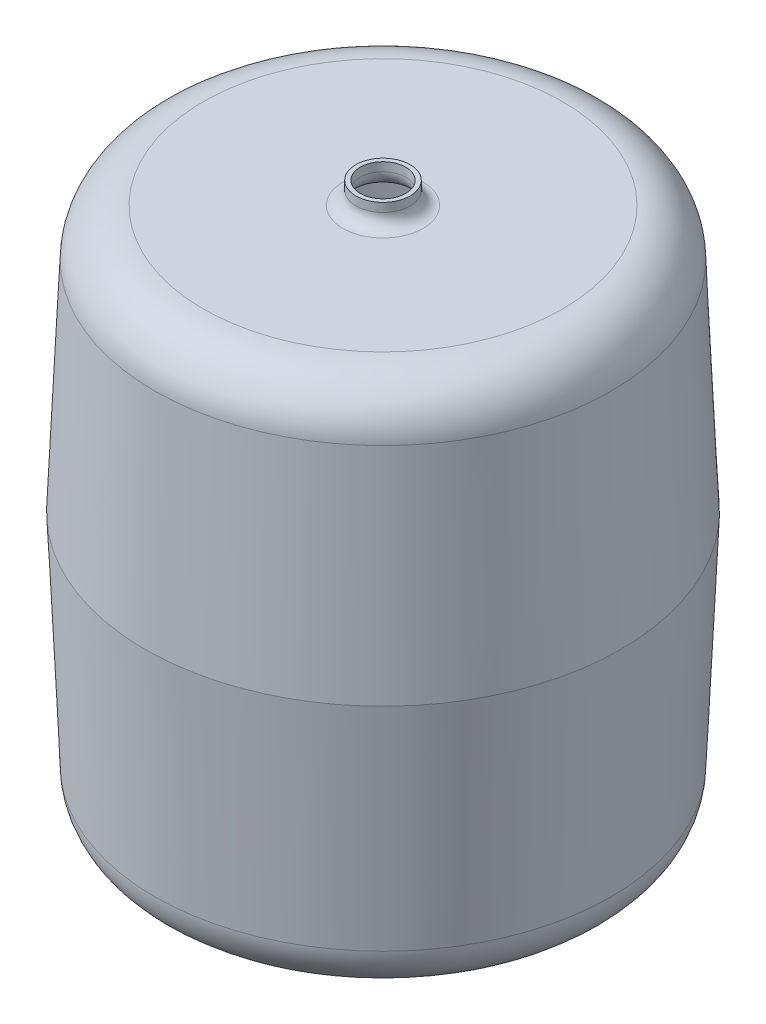
ISO-10303-21;
HEADER;
FILE_DESCRIPTION(('STEP AP214'),'2;1');
FILE_NAME('part.step','',(''),(''),'','','');
FILE_SCHEMA(('AUTOMOTIVE_DESIGN { 1 0 10303 214 1 1 1 1 }'));
ENDSEC;
DATA;
#1=APPLICATION_CONTEXT('core data for automotive mechanical design processes');
#2=APPLICATION_PROTOCOL_DEFINITION('international standard','automotive_design',2000,#1);
#3=PRODUCT_CONTEXT('',#1,'mechanical');
#4=PRODUCT('Part','Part','',(#3));
#5=PRODUCT_RELATED_PRODUCT_CATEGORY('part','',(#4));
#6=PRODUCT_DEFINITION_FORMATION('','',#4);
#7=PRODUCT_DEFINITION_CONTEXT('part definition',#1,'design');
#8=PRODUCT_DEFINITION('design','',#6,#7);
#9=PRODUCT_DEFINITION_SHAPE('','',#8);
#10=(LENGTH_UNIT() NAMED_UNIT(*) SI_UNIT(.MILLI.,.METRE.));
#11=(NAMED_UNIT(*) PLANE_ANGLE_UNIT() SI_UNIT($,.RADIAN.));
#12=(NAMED_UNIT(*) SI_UNIT($,.STERADIAN.) SOLID_ANGLE_UNIT());
#13=UNCERTAINTY_MEASURE_WITH_UNIT(LENGTH_MEASURE(1.E-05),#10,'distance_accuracy_value','');
#14=(GEOMETRIC_REPRESENTATION_CONTEXT(3) GLOBAL_UNCERTAINTY_ASSIGNED_CONTEXT((#13)) GLOBAL_UNIT_ASSIGNED_CONTEXT((#10,
#11,#12)) REPRESENTATION_CONTEXT('',''));
#15=CARTESIAN_POINT('',(0.,0.,0.));
#16=DIRECTION('',(0.,0.,1.));
#17=DIRECTION('',(1.,0.,0.));
#18=AXIS2_PLACEMENT_3D('',#15,#16,#17);
#19=CARTESIAN_POINT('',(0.,-2.89220124028748E-13,0.));
#20=DIRECTION('',(0.,-1.,0.));
#21=DIRECTION('',(1.,0.,0.));
#22=AXIS2_PLACEMENT_3D('',#19,#20,#21);
#23=PLANE('',#22);
#24=CARTESIAN_POINT('',(0.,-8.88178419700125E-13,0.));
#25=DIRECTION('',(0.,-1.,0.));
#26=DIRECTION('',(1.,0.,0.));
#27=AXIS2_PLACEMENT_3D('',#24,#25,#26);
#28=CIRCLE('',#27,165.671871598533);
#29=CARTESIAN_POINT('',(165.671871598533,-3.0973817164263E-13,0.));
#30=VERTEX_POINT('',#29);
#31=EDGE_CURVE('E10',#30,#30,#28,.T.);
#32=ORIENTED_EDGE('',*,*,#31,.T.);
#33=EDGE_LOOP('',(#32));
#34=FACE_BOUND('',#33,.T.);
#35=ADVANCED_FACE('F37',(#34),#23,.T.);
#36=CARTESIAN_POINT('',(-1.38777878078145E-13,44.9999999999991,0.));
#37=DIRECTION('',(0.,-1.,0.));
#38=DIRECTION('',(1.,0.,0.));
#39=AXIS2_PLACEMENT_3D('',#36,#37,#38);
#40=TOROIDAL_SURFACE('',#39,165.671871598534,45.);
#41=CARTESIAN_POINT('',(-1.50263327783035E-13,43.0371275685593,0.));
#42=DIRECTION('',(0.,-1.,0.));
#43=DIRECTION('',(1.,0.,0.));
#44=AXIS2_PLACEMENT_3D('',#41,#42,#43);
#45=CIRCLE('',#44,210.629041569717);
#46=CARTESIAN_POINT('',(210.629041569717,43.03712756856,0.));
#47=VERTEX_POINT('',#46);
#48=EDGE_CURVE('E43',#47,#47,#45,.T.);
#49=ORIENTED_EDGE('',*,*,#48,.T.);
#50=EDGE_LOOP('',(#49));
#51=FACE_BOUND('',#50,.T.);
#52=ORIENTED_EDGE('',*,*,#31,.F.);
#53=EDGE_LOOP('',(#52));
#54=FACE_BOUND('',#53,.T.);
#55=ADVANCED_FACE('F105',(#51,#54),#40,.T.);
#56=CARTESIAN_POINT('',(-1.50263327783035E-13,43.0371275685593,0.));
#57=DIRECTION('',(0.,1.,0.));
#58=DIRECTION('',(-1.,0.,0.));
#59=AXIS2_PLACEMENT_3D('',#56,#57,#58);
#60=CONICAL_SURFACE('',#59,210.629041569717,0.0436332312998579);
#61=CARTESIAN_POINT('',(-8.55412928016564E-13,244.999999999999,0.));
#62=DIRECTION('',(0.,-1.,0.));
#63=DIRECTION('',(1.,0.,0.));
#64=AXIS2_PLACEMENT_3D('',#61,#62,#63);
#65=CIRCLE('',#64,219.446931012585);
#66=CARTESIAN_POINT('',(219.446931012585,245.,0.));
#67=VERTEX_POINT('',#66);
#68=EDGE_CURVE('E47',#67,#67,#65,.T.);
#69=ORIENTED_EDGE('',*,*,#68,.T.);
#70=EDGE_LOOP('',(#69));
#71=FACE_BOUND('',#70,.T.);
#72=ORIENTED_EDGE('',*,*,#48,.F.);
#73=EDGE_LOOP('',(#72));
#74=FACE_BOUND('',#73,.T.);
#75=ADVANCED_FACE('F109',(#71,#74),#60,.T.);
#76=CARTESIAN_POINT('',(-8.55412928016564E-13,244.999999999999,0.));
#77=DIRECTION('',(0.,-1.,0.));
#78=DIRECTION('',(1.,0.,0.));
#79=AXIS2_PLACEMENT_3D('',#76,#77,#78);
#80=CONICAL_SURFACE('',#79,219.446931012585,0.0436332312998513);
#81=CARTESIAN_POINT('',(-1.56056252825009E-12,446.962872431439,0.));
#82=DIRECTION('',(0.,-1.,0.));
#83=DIRECTION('',(1.,0.,0.));
#84=AXIS2_PLACEMENT_3D('',#81,#82,#83);
#85=CIRCLE('',#84,210.629041569719);
#86=CARTESIAN_POINT('',(210.629041569717,446.96287243144,0.));
#87=VERTEX_POINT('',#86);
#88=EDGE_CURVE('E51',#87,#87,#85,.T.);
#89=ORIENTED_EDGE('',*,*,#88,.T.);
#90=EDGE_LOOP('',(#89));
#91=FACE_BOUND('',#90,.T.);
#92=ORIENTED_EDGE('',*,*,#68,.F.);
#93=EDGE_LOOP('',(#92));
#94=FACE_BOUND('',#93,.T.);
#95=ADVANCED_FACE('F113',(#91,#94),#80,.T.);
#96=CARTESIAN_POINT('',(-1.55431223447522E-12,444.999999999999,0.));
#97=DIRECTION('',(0.,-1.,0.));
#98=DIRECTION('',(1.,0.,0.));
#99=AXIS2_PLACEMENT_3D('',#96,#97,#98);
#100=TOROIDAL_SURFACE('',#99,165.671871598535,45.);
#101=CARTESIAN_POINT('',(-1.71082585603313E-12,489.999999999999,0.));
#102=DIRECTION('',(0.,-1.,0.));
#103=DIRECTION('',(1.,0.,0.));
#104=AXIS2_PLACEMENT_3D('',#101,#102,#103);
#105=CIRCLE('',#104,165.671871598535);
#106=CARTESIAN_POINT('',(165.671871598533,490.,0.));
#107=VERTEX_POINT('',#106);
#108=EDGE_CURVE('E56',#107,#107,#105,.T.);
#109=ORIENTED_EDGE('',*,*,#108,.T.);
#110=EDGE_LOOP('',(#109));
#111=FACE_BOUND('',#110,.T.);
#112=ORIENTED_EDGE('',*,*,#88,.F.);
#113=EDGE_LOOP('',(#112));
#114=FACE_BOUND('',#113,.T.);
#115=ADVANCED_FACE('F120',(#111,#114),#100,.T.);
#116=CARTESIAN_POINT('',(165.671871598533,490.,0.));
#117=DIRECTION('',(0.,1.,0.));
#118=DIRECTION('',(-1.,0.,0.));
#119=AXIS2_PLACEMENT_3D('',#116,#117,#118);
#120=PLANE('',#119);
#121=CARTESIAN_POINT('',(-1.71082585603314E-12,490.,0.));
#122=DIRECTION('',(0.,-1.,0.));
#123=DIRECTION('',(1.,0.,0.));
#124=AXIS2_PLACEMENT_3D('',#121,#122,#123);
#125=CIRCLE('',#124,37.0000000000017);
#126=CARTESIAN_POINT('',(37.,490.,0.));
#127=VERTEX_POINT('',#126);
#128=EDGE_CURVE('E59',#127,#127,#125,.T.);
#129=ORIENTED_EDGE('',*,*,#128,.T.);
#130=EDGE_LOOP('',(#129));
#131=FACE_BOUND('',#130,.T.);
#132=ORIENTED_EDGE('',*,*,#108,.F.);
#133=EDGE_LOOP('',(#132));
#134=FACE_BOUND('',#133,.T.);
#135=ADVANCED_FACE('F124',(#131,#134),#120,.T.);
#136=CARTESIAN_POINT('',(-1.74860126378462E-12,502.,0.));
#137=DIRECTION('',(0.,-1.,0.));
#138=DIRECTION('',(1.,0.,0.));
#139=AXIS2_PLACEMENT_3D('',#136,#137,#138);
#140=TOROIDAL_SURFACE('',#139,37.0000000000018,12.);
#141=CARTESIAN_POINT('',(-1.75272363209925E-12,502.,0.));
#142=DIRECTION('',(0.,-1.,0.));
#143=DIRECTION('',(1.,0.,0.));
#144=AXIS2_PLACEMENT_3D('',#141,#142,#143);
#145=CIRCLE('',#144,25.0000000000018);
#146=CARTESIAN_POINT('',(25.,502.,0.));
#147=VERTEX_POINT('',#146);
#148=EDGE_CURVE('E62',#147,#147,#145,.T.);
#149=ORIENTED_EDGE('',*,*,#148,.T.);
#150=EDGE_LOOP('',(#149));
#151=FACE_BOUND('',#150,.T.);
#152=ORIENTED_EDGE('',*,*,#128,.F.);
#153=EDGE_LOOP('',(#152));
#154=FACE_BOUND('',#153,.T.);
#155=ADVANCED_FACE('F128',(#151,#154),#140,.F.);
#156=CARTESIAN_POINT('',(1.88372292656477E-11,-5395.19689138285,0.));
#157=DIRECTION('',(0.,-1.,0.));
#158=DIRECTION('',(1.,0.,0.));
#159=AXIS2_PLACEMENT_3D('',#156,#157,#158);
#160=CYLINDRICAL_SURFACE('',#159,25.0000000000018);
#161=CARTESIAN_POINT('',(-1.78065548281E-12,510.,0.));
#162=DIRECTION('',(0.,-1.,0.));
#163=DIRECTION('',(1.,0.,0.));
#164=AXIS2_PLACEMENT_3D('',#161,#162,#163);
#165=CIRCLE('',#164,25.0000000000018);
#166=CARTESIAN_POINT('',(25.,510.,0.));
#167=VERTEX_POINT('',#166);
#168=EDGE_CURVE('E65',#167,#167,#165,.T.);
#169=ORIENTED_EDGE('',*,*,#168,.T.);
#170=EDGE_LOOP('',(#169));
#171=FACE_BOUND('',#170,.T.);
#172=ORIENTED_EDGE('',*,*,#148,.F.);
#173=EDGE_LOOP('',(#172));
#174=FACE_BOUND('',#173,.T.);
#175=ADVANCED_FACE('F132',(#171,#174),#160,.T.);
#176=CARTESIAN_POINT('',(21.,510.,0.));
#177=DIRECTION('',(0.,1.,0.));
#178=DIRECTION('',(-1.,0.,0.));
#179=AXIS2_PLACEMENT_3D('',#176,#177,#178);
#180=PLANE('',#179);
#181=CARTESIAN_POINT('',(-1.78065548281E-12,510.,0.));
#182=DIRECTION('',(0.,-1.,0.));
#183=DIRECTION('',(1.,0.,0.));
#184=AXIS2_PLACEMENT_3D('',#181,#182,#183);
#185=CIRCLE('',#184,21.0000000000018);
#186=CARTESIAN_POINT('',(21.,510.,0.));
#187=VERTEX_POINT('',#186);
#188=EDGE_CURVE('E68',#187,#187,#185,.T.);
#189=ORIENTED_EDGE('',*,*,#188,.T.);
#190=EDGE_LOOP('',(#189));
#191=FACE_BOUND('',#190,.T.);
#192=ORIENTED_EDGE('',*,*,#168,.F.);
#193=EDGE_LOOP('',(#192));
#194=FACE_BOUND('',#193,.T.);
#195=ADVANCED_FACE('F136',(#191,#194),#180,.T.);
#196=CARTESIAN_POINT('',(1.88372292656477E-11,-5395.19689138285,0.));
#197=DIRECTION('',(0.,-1.,0.));
#198=DIRECTION('',(1.,0.,0.));
#199=AXIS2_PLACEMENT_3D('',#196,#197,#198);
#200=CYLINDRICAL_SURFACE('',#199,21.0000000000018);
#201=CARTESIAN_POINT('',(-1.75272363209925E-12,502.,0.));
#202=DIRECTION('',(0.,-1.,0.));
#203=DIRECTION('',(1.,0.,0.));
#204=AXIS2_PLACEMENT_3D('',#201,#202,#203);
#205=CIRCLE('',#204,21.0000000000018);
#206=CARTESIAN_POINT('',(21.,502.,0.));
#207=VERTEX_POINT('',#206);
#208=EDGE_CURVE('E71',#207,#207,#205,.T.);
#209=ORIENTED_EDGE('',*,*,#208,.T.);
#210=EDGE_LOOP('',(#209));
#211=FACE_BOUND('',#210,.T.);
#212=ORIENTED_EDGE('',*,*,#188,.F.);
#213=EDGE_LOOP('',(#212));
#214=FACE_BOUND('',#213,.T.);
#215=ADVANCED_FACE('F140',(#211,#214),#200,.F.);
#216=CARTESIAN_POINT('',(-1.74860126378462E-12,502.,0.));
#217=DIRECTION('',(0.,-1.,0.));
#218=DIRECTION('',(1.,0.,0.));
#219=AXIS2_PLACEMENT_3D('',#216,#217,#218);
#220=TOROIDAL_SURFACE('',#219,37.0000000000018,16.);
#221=CARTESIAN_POINT('',(-1.69685993067776E-12,486.,0.));
#222=DIRECTION('',(0.,-1.,0.));
#223=DIRECTION('',(1.,0.,0.));
#224=AXIS2_PLACEMENT_3D('',#221,#222,#223);
#225=CIRCLE('',#224,37.0000000000017);
#226=CARTESIAN_POINT('',(37.,486.,0.));
#227=VERTEX_POINT('',#226);
#228=EDGE_CURVE('E74',#227,#227,#225,.T.);
#229=ORIENTED_EDGE('',*,*,#228,.T.);
#230=EDGE_LOOP('',(#229));
#231=FACE_BOUND('',#230,.T.);
#232=ORIENTED_EDGE('',*,*,#208,.F.);
#233=EDGE_LOOP('',(#232));
#234=FACE_BOUND('',#233,.T.);
#235=ADVANCED_FACE('F144',(#231,#234),#220,.T.);
#236=CARTESIAN_POINT('',(165.671871598533,486.,0.));
#237=DIRECTION('',(0.,-1.,0.));
#238=DIRECTION('',(1.,0.,0.));
#239=AXIS2_PLACEMENT_3D('',#236,#237,#238);
#240=PLANE('',#239);
#241=CARTESIAN_POINT('',(-1.69685993067776E-12,485.999999999999,0.));
#242=DIRECTION('',(0.,-1.,0.));
#243=DIRECTION('',(1.,0.,0.));
#244=AXIS2_PLACEMENT_3D('',#241,#242,#243);
#245=CIRCLE('',#244,165.671871598535);
#246=CARTESIAN_POINT('',(165.671871598533,485.999999999999,0.));
#247=VERTEX_POINT('',#246);
#248=EDGE_CURVE('E77',#247,#247,#245,.T.);
#249=ORIENTED_EDGE('',*,*,#248,.T.);
#250=EDGE_LOOP('',(#249));
#251=FACE_BOUND('',#250,.T.);
#252=ORIENTED_EDGE('',*,*,#228,.F.);
#253=EDGE_LOOP('',(#252));
#254=FACE_BOUND('',#253,.T.);
#255=ADVANCED_FACE('F148',(#251,#254),#240,.T.);
#256=CARTESIAN_POINT('',(-1.55431223447522E-12,444.999999999999,0.));
#257=DIRECTION('',(0.,-1.,0.));
#258=DIRECTION('',(1.,0.,0.));
#259=AXIS2_PLACEMENT_3D('',#256,#257,#258);
#260=TOROIDAL_SURFACE('',#259,165.671871598535,41.);
#261=CARTESIAN_POINT('',(-1.5599533431421E-12,446.788394881978,0.));
#262=DIRECTION('',(0.,-1.,0.));
#263=DIRECTION('',(1.,0.,0.));
#264=AXIS2_PLACEMENT_3D('',#261,#262,#263);
#265=CIRCLE('',#264,206.632848683391);
#266=CARTESIAN_POINT('',(206.63284868339,446.788394881978,0.));
#267=VERTEX_POINT('',#266);
#268=EDGE_CURVE('E80',#267,#267,#265,.T.);
#269=ORIENTED_EDGE('',*,*,#268,.T.);
#270=EDGE_LOOP('',(#269));
#271=FACE_BOUND('',#270,.T.);
#272=ORIENTED_EDGE('',*,*,#248,.F.);
#273=EDGE_LOOP('',(#272));
#274=FACE_BOUND('',#273,.T.);
#275=ADVANCED_FACE('F152',(#271,#274),#260,.F.);
#276=CARTESIAN_POINT('',(-1.5599533431421E-12,446.788394881978,0.));
#277=DIRECTION('',(0.,-1.,0.));
#278=DIRECTION('',(1.,0.,0.));
#279=AXIS2_PLACEMENT_3D('',#276,#277,#278);
#280=CONICAL_SURFACE('',#279,206.632848683391,0.0436332312998515);
#281=CARTESIAN_POINT('',(-8.55412928016564E-13,244.999999999999,0.));
#282=DIRECTION('',(0.,-1.,0.));
#283=DIRECTION('',(1.,0.,0.));
#284=AXIS2_PLACEMENT_3D('',#281,#282,#283);
#285=CIRCLE('',#284,215.443120271932);
#286=CARTESIAN_POINT('',(215.443120271931,245.,0.));
#287=VERTEX_POINT('',#286);
#288=EDGE_CURVE('E83',#287,#287,#285,.T.);
#289=ORIENTED_EDGE('',*,*,#288,.T.);
#290=EDGE_LOOP('',(#289));
#291=FACE_BOUND('',#290,.T.);
#292=ORIENTED_EDGE('',*,*,#268,.F.);
#293=EDGE_LOOP('',(#292));
#294=FACE_BOUND('',#293,.T.);
#295=ADVANCED_FACE('F156',(#291,#294),#280,.F.);
#296=CARTESIAN_POINT('',(-8.55412928016564E-13,244.999999999999,0.));
#297=DIRECTION('',(0.,1.,0.));
#298=DIRECTION('',(-1.,0.,0.));
#299=AXIS2_PLACEMENT_3D('',#296,#297,#298);
#300=CONICAL_SURFACE('',#299,215.443120271932,0.0436332312998579);
#301=CARTESIAN_POINT('',(-1.50872512891024E-13,43.21160511802,0.));
#302=DIRECTION('',(0.,-1.,0.));
#303=DIRECTION('',(1.,0.,0.));
#304=AXIS2_PLACEMENT_3D('',#301,#302,#303);
#305=CIRCLE('',#304,206.63284868339);
#306=CARTESIAN_POINT('',(206.63284868339,43.2116051180207,0.));
#307=VERTEX_POINT('',#306);
#308=EDGE_CURVE('E86',#307,#307,#305,.T.);
#309=ORIENTED_EDGE('',*,*,#308,.T.);
#310=EDGE_LOOP('',(#309));
#311=FACE_BOUND('',#310,.T.);
#312=ORIENTED_EDGE('',*,*,#288,.F.);
#313=EDGE_LOOP('',(#312));
#314=FACE_BOUND('',#313,.T.);
#315=ADVANCED_FACE('F102',(#311,#314),#300,.F.);
#316=CARTESIAN_POINT('',(-1.38777878078145E-13,44.9999999999991,0.));
#317=DIRECTION('',(0.,-1.,0.));
#318=DIRECTION('',(1.,0.,0.));
#319=AXIS2_PLACEMENT_3D('',#316,#317,#318);
#320=TOROIDAL_SURFACE('',#319,165.671871598534,41.);
#321=CARTESIAN_POINT('',(0.,3.99999999999956,0.));
#322=DIRECTION('',(0.,-1.,0.));
#323=DIRECTION('',(1.,0.,0.));
#324=AXIS2_PLACEMENT_3D('',#321,#322,#323);
#325=CIRCLE('',#324,165.671871598533);
#326=CARTESIAN_POINT('',(165.671871598533,4.00000000000014,0.));
#327=VERTEX_POINT('',#326);
#328=EDGE_CURVE('E89',#327,#327,#325,.T.);
#329=ORIENTED_EDGE('',*,*,#328,.T.);
#330=EDGE_LOOP('',(#329));
#331=FACE_BOUND('',#330,.T.);
#332=ORIENTED_EDGE('',*,*,#308,.F.);
#333=EDGE_LOOP('',(#332));
#334=FACE_BOUND('',#333,.T.);
#335=ADVANCED_FACE('F93',(#331,#334),#320,.F.);
#336=CARTESIAN_POINT('',(0.,3.99999999999972,0.));
#337=DIRECTION('',(0.,1.,0.));
#338=DIRECTION('',(-1.,0.,0.));
#339=AXIS2_PLACEMENT_3D('',#336,#337,#338);
#340=PLANE('',#339);
#341=ORIENTED_EDGE('',*,*,#328,.F.);
#342=EDGE_LOOP('',(#341));
#343=FACE_BOUND('',#342,.T.);
#344=ADVANCED_FACE('F96',(#343),#340,.T.);
#345=CLOSED_SHELL('',(#35,#55,#75,#95,#115,#135,#155,#175,#195,#215,#235,#255,#275,#295,#315,
#335,#344));
#346=MANIFOLD_SOLID_BREP('B2',#345);
#347=ADVANCED_BREP_SHAPE_REPRESENTATION('',(#18,#346),#14);
#348=SHAPE_DEFINITION_REPRESENTATION(#9,#347);
ENDSEC;
END-ISO-10303-21;
